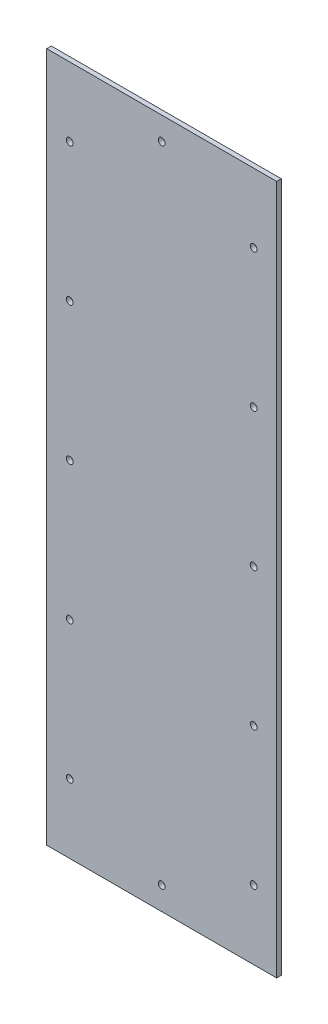
ISO-10303-21;
HEADER;
FILE_DESCRIPTION(('STEP AP214'),'2;1');
FILE_NAME('part.step','',(''),(''),'','','');
FILE_SCHEMA(('AUTOMOTIVE_DESIGN { 1 0 10303 214 1 1 1 1 }'));
ENDSEC;
DATA;
#1=APPLICATION_CONTEXT('core data for automotive mechanical design processes');
#2=APPLICATION_PROTOCOL_DEFINITION('international standard','automotive_design',2000,#1);
#3=PRODUCT_CONTEXT('',#1,'mechanical');
#4=PRODUCT('Part','Part','',(#3));
#5=PRODUCT_RELATED_PRODUCT_CATEGORY('part','',(#4));
#6=PRODUCT_DEFINITION_FORMATION('','',#4);
#7=PRODUCT_DEFINITION_CONTEXT('part definition',#1,'design');
#8=PRODUCT_DEFINITION('design','',#6,#7);
#9=PRODUCT_DEFINITION_SHAPE('','',#8);
#10=(LENGTH_UNIT() NAMED_UNIT(*) SI_UNIT(.MILLI.,.METRE.));
#11=(NAMED_UNIT(*) PLANE_ANGLE_UNIT() SI_UNIT($,.RADIAN.));
#12=(NAMED_UNIT(*) SI_UNIT($,.STERADIAN.) SOLID_ANGLE_UNIT());
#13=UNCERTAINTY_MEASURE_WITH_UNIT(LENGTH_MEASURE(1.E-05),#10,'distance_accuracy_value','');
#14=(GEOMETRIC_REPRESENTATION_CONTEXT(3) GLOBAL_UNCERTAINTY_ASSIGNED_CONTEXT((#13)) GLOBAL_UNIT_ASSIGNED_CONTEXT((#10,
#11,#12)) REPRESENTATION_CONTEXT('',''));
#15=CARTESIAN_POINT('',(0.,0.,0.));
#16=DIRECTION('',(0.,0.,1.));
#17=DIRECTION('',(1.,0.,0.));
#18=AXIS2_PLACEMENT_3D('',#15,#16,#17);
#19=CARTESIAN_POINT('',(0.,0.,2.));
#20=DIRECTION('',(0.,0.,1.));
#21=DIRECTION('',(1.,0.,0.));
#22=AXIS2_PLACEMENT_3D('',#19,#20,#21);
#23=PLANE('',#22);
#24=CARTESIAN_POINT('',(50.,-10.,2.));
#25=DIRECTION('',(0.,0.,1.));
#26=DIRECTION('',(1.,0.,0.));
#27=AXIS2_PLACEMENT_3D('',#24,#25,#26);
#28=CIRCLE('',#27,1.5);
#29=CARTESIAN_POINT('',(51.5,-10.,2.));
#30=VERTEX_POINT('',#29);
#31=EDGE_CURVE('E162',#30,#30,#28,.T.);
#32=ORIENTED_EDGE('',*,*,#31,.F.);
#33=EDGE_LOOP('',(#32));
#34=FACE_BOUND('',#33,.T.);
#35=CARTESIAN_POINT('',(90.,-90.,2.));
#36=DIRECTION('',(0.,0.,-1.));
#37=DIRECTION('',(-1.,0.,0.));
#38=AXIS2_PLACEMENT_3D('',#35,#36,#37);
#39=CIRCLE('',#38,1.50000000000002);
#40=CARTESIAN_POINT('',(88.5,-90.,2.));
#41=VERTEX_POINT('',#40);
#42=EDGE_CURVE('E207',#41,#41,#39,.T.);
#43=ORIENTED_EDGE('',*,*,#42,.T.);
#44=EDGE_LOOP('',(#43));
#45=FACE_BOUND('',#44,.T.);
#46=CARTESIAN_POINT('',(10.,-210.,2.));
#47=DIRECTION('',(0.,0.,-1.));
#48=DIRECTION('',(-1.,0.,0.));
#49=AXIS2_PLACEMENT_3D('',#46,#47,#48);
#50=CIRCLE('',#49,1.5);
#51=CARTESIAN_POINT('',(8.50000000000001,-210.,2.));
#52=VERTEX_POINT('',#51);
#53=EDGE_CURVE('E133',#52,#52,#50,.T.);
#54=ORIENTED_EDGE('',*,*,#53,.T.);
#55=EDGE_LOOP('',(#54));
#56=FACE_BOUND('',#55,.T.);
#57=CARTESIAN_POINT('',(50.,-290.,2.));
#58=DIRECTION('',(0.,0.,-1.));
#59=DIRECTION('',(-1.,0.,0.));
#60=AXIS2_PLACEMENT_3D('',#57,#58,#59);
#61=CIRCLE('',#60,1.5);
#62=CARTESIAN_POINT('',(48.5,-290.,2.));
#63=VERTEX_POINT('',#62);
#64=EDGE_CURVE('E184',#63,#63,#61,.T.);
#65=ORIENTED_EDGE('',*,*,#64,.T.);
#66=EDGE_LOOP('',(#65));
#67=FACE_BOUND('',#66,.T.);
#68=CARTESIAN_POINT('',(90.0000000000001,-270.,2.));
#69=DIRECTION('',(0.,0.,1.));
#70=DIRECTION('',(1.,0.,0.));
#71=AXIS2_PLACEMENT_3D('',#68,#69,#70);
#72=CIRCLE('',#71,1.49999999999998);
#73=CARTESIAN_POINT('',(91.5000000000001,-270.,2.));
#74=VERTEX_POINT('',#73);
#75=EDGE_CURVE('E176',#74,#74,#72,.T.);
#76=ORIENTED_EDGE('',*,*,#75,.F.);
#77=EDGE_LOOP('',(#76));
#78=FACE_BOUND('',#77,.T.);
#79=CARTESIAN_POINT('',(90.,-210.,2.));
#80=DIRECTION('',(0.,0.,1.));
#81=DIRECTION('',(1.,0.,0.));
#82=AXIS2_PLACEMENT_3D('',#79,#80,#81);
#83=CIRCLE('',#82,1.5);
#84=CARTESIAN_POINT('',(91.5,-210.,2.));
#85=VERTEX_POINT('',#84);
#86=EDGE_CURVE('E167',#85,#85,#83,.T.);
#87=ORIENTED_EDGE('',*,*,#86,.F.);
#88=EDGE_LOOP('',(#87));
#89=FACE_BOUND('',#88,.T.);
#90=DIRECTION('',(0.,-1.,0.));
#91=VECTOR('',#90,1.);
#92=CARTESIAN_POINT('',(0.,0.,2.));
#93=LINE('',#92,#91);
#94=CARTESIAN_POINT('',(0.,0.,2.));
#95=VERTEX_POINT('',#94);
#96=CARTESIAN_POINT('',(0.,-300.,2.));
#97=VERTEX_POINT('',#96);
#98=EDGE_CURVE('E91',#95,#97,#93,.T.);
#99=ORIENTED_EDGE('',*,*,#98,.T.);
#100=DIRECTION('',(1.,0.,0.));
#101=VECTOR('',#100,1.);
#102=CARTESIAN_POINT('',(0.,-300.,2.));
#103=LINE('',#102,#101);
#104=CARTESIAN_POINT('',(100.,-300.,2.));
#105=VERTEX_POINT('',#104);
#106=EDGE_CURVE('E86',#97,#105,#103,.T.);
#107=ORIENTED_EDGE('',*,*,#106,.T.);
#108=DIRECTION('',(0.,1.,0.));
#109=VECTOR('',#108,1.);
#110=CARTESIAN_POINT('',(100.,0.,2.));
#111=LINE('',#110,#109);
#112=CARTESIAN_POINT('',(100.,0.,2.));
#113=VERTEX_POINT('',#112);
#114=EDGE_CURVE('E89',#105,#113,#111,.T.);
#115=ORIENTED_EDGE('',*,*,#114,.T.);
#116=DIRECTION('',(-1.,0.,0.));
#117=VECTOR('',#116,1.);
#118=CARTESIAN_POINT('',(0.,0.,2.));
#119=LINE('',#118,#117);
#120=EDGE_CURVE('E56',#113,#95,#119,.T.);
#121=ORIENTED_EDGE('',*,*,#120,.T.);
#122=EDGE_LOOP('',(#99,#107,#115,#121));
#123=FACE_BOUND('',#122,.T.);
#124=CARTESIAN_POINT('',(9.99999999999999,-270.,2.));
#125=DIRECTION('',(0.,0.,-1.));
#126=DIRECTION('',(-1.,0.,0.));
#127=AXIS2_PLACEMENT_3D('',#124,#125,#126);
#128=CIRCLE('',#127,1.5);
#129=CARTESIAN_POINT('',(8.49999999999999,-270.,2.));
#130=VERTEX_POINT('',#129);
#131=EDGE_CURVE('E134',#130,#130,#128,.T.);
#132=ORIENTED_EDGE('',*,*,#131,.T.);
#133=EDGE_LOOP('',(#132));
#134=FACE_BOUND('',#133,.T.);
#135=CARTESIAN_POINT('',(10.,-150.,2.));
#136=DIRECTION('',(0.,0.,1.));
#137=DIRECTION('',(1.,0.,0.));
#138=AXIS2_PLACEMENT_3D('',#135,#136,#137);
#139=CIRCLE('',#138,1.5);
#140=CARTESIAN_POINT('',(11.5,-150.,2.));
#141=VERTEX_POINT('',#140);
#142=EDGE_CURVE('E142',#141,#141,#139,.T.);
#143=ORIENTED_EDGE('',*,*,#142,.F.);
#144=EDGE_LOOP('',(#143));
#145=FACE_BOUND('',#144,.T.);
#146=CARTESIAN_POINT('',(10.,-90.,2.));
#147=DIRECTION('',(0.,0.,1.));
#148=DIRECTION('',(1.,0.,0.));
#149=AXIS2_PLACEMENT_3D('',#146,#147,#148);
#150=CIRCLE('',#149,1.5);
#151=CARTESIAN_POINT('',(11.5,-90.,2.));
#152=VERTEX_POINT('',#151);
#153=EDGE_CURVE('E150',#152,#152,#150,.T.);
#154=ORIENTED_EDGE('',*,*,#153,.F.);
#155=EDGE_LOOP('',(#154));
#156=FACE_BOUND('',#155,.T.);
#157=CARTESIAN_POINT('',(9.99999999999999,-30.,2.));
#158=DIRECTION('',(0.,0.,1.));
#159=DIRECTION('',(1.,0.,0.));
#160=AXIS2_PLACEMENT_3D('',#157,#158,#159);
#161=CIRCLE('',#160,1.5);
#162=CARTESIAN_POINT('',(11.5,-30.,2.));
#163=VERTEX_POINT('',#162);
#164=EDGE_CURVE('E158',#163,#163,#161,.T.);
#165=ORIENTED_EDGE('',*,*,#164,.F.);
#166=EDGE_LOOP('',(#165));
#167=FACE_BOUND('',#166,.T.);
#168=CARTESIAN_POINT('',(90.,-150.,2.));
#169=DIRECTION('',(0.,0.,-1.));
#170=DIRECTION('',(-1.,0.,0.));
#171=AXIS2_PLACEMENT_3D('',#168,#169,#170);
#172=CIRCLE('',#171,1.50000000000001);
#173=CARTESIAN_POINT('',(88.5,-150.,2.));
#174=VERTEX_POINT('',#173);
#175=EDGE_CURVE('E168',#174,#174,#172,.T.);
#176=ORIENTED_EDGE('',*,*,#175,.T.);
#177=EDGE_LOOP('',(#176));
#178=FACE_BOUND('',#177,.T.);
#179=CARTESIAN_POINT('',(90.,-30.,2.));
#180=DIRECTION('',(0.,0.,-1.));
#181=DIRECTION('',(-1.,0.,0.));
#182=AXIS2_PLACEMENT_3D('',#179,#180,#181);
#183=CIRCLE('',#182,1.50000000000001);
#184=CARTESIAN_POINT('',(88.5,-30.,2.));
#185=VERTEX_POINT('',#184);
#186=EDGE_CURVE('E199',#185,#185,#183,.T.);
#187=ORIENTED_EDGE('',*,*,#186,.T.);
#188=EDGE_LOOP('',(#187));
#189=FACE_BOUND('',#188,.T.);
#190=ADVANCED_FACE('F38',(#34,#45,#56,#67,#78,#89,#123,#134,#145,#156,#167,#178,#189),#23,.T.);
#191=CARTESIAN_POINT('',(0.,0.,0.));
#192=DIRECTION('',(0.,0.,1.));
#193=DIRECTION('',(1.,0.,0.));
#194=AXIS2_PLACEMENT_3D('',#191,#192,#193);
#195=PLANE('',#194);
#196=CARTESIAN_POINT('',(50.,-10.,0.));
#197=DIRECTION('',(0.,0.,1.));
#198=DIRECTION('',(1.,0.,0.));
#199=AXIS2_PLACEMENT_3D('',#196,#197,#198);
#200=CIRCLE('',#199,1.5);
#201=CARTESIAN_POINT('',(51.5,-10.,0.));
#202=VERTEX_POINT('',#201);
#203=EDGE_CURVE('E111',#202,#202,#200,.T.);
#204=ORIENTED_EDGE('',*,*,#203,.T.);
#205=EDGE_LOOP('',(#204));
#206=FACE_BOUND('',#205,.T.);
#207=CARTESIAN_POINT('',(9.99999999999999,-30.,0.));
#208=DIRECTION('',(0.,0.,1.));
#209=DIRECTION('',(1.,0.,0.));
#210=AXIS2_PLACEMENT_3D('',#207,#208,#209);
#211=CIRCLE('',#210,1.5);
#212=CARTESIAN_POINT('',(11.5,-30.,0.));
#213=VERTEX_POINT('',#212);
#214=EDGE_CURVE('E154',#213,#213,#211,.T.);
#215=ORIENTED_EDGE('',*,*,#214,.T.);
#216=EDGE_LOOP('',(#215));
#217=FACE_BOUND('',#216,.T.);
#218=CARTESIAN_POINT('',(10.,-90.,0.));
#219=DIRECTION('',(0.,0.,1.));
#220=DIRECTION('',(1.,0.,0.));
#221=AXIS2_PLACEMENT_3D('',#218,#219,#220);
#222=CIRCLE('',#221,1.5);
#223=CARTESIAN_POINT('',(11.5,-90.,0.));
#224=VERTEX_POINT('',#223);
#225=EDGE_CURVE('E146',#224,#224,#222,.T.);
#226=ORIENTED_EDGE('',*,*,#225,.T.);
#227=EDGE_LOOP('',(#226));
#228=FACE_BOUND('',#227,.T.);
#229=CARTESIAN_POINT('',(10.,-150.,0.));
#230=DIRECTION('',(0.,0.,1.));
#231=DIRECTION('',(1.,0.,0.));
#232=AXIS2_PLACEMENT_3D('',#229,#230,#231);
#233=CIRCLE('',#232,1.5);
#234=CARTESIAN_POINT('',(11.5,-150.,0.));
#235=VERTEX_POINT('',#234);
#236=EDGE_CURVE('E138',#235,#235,#233,.T.);
#237=ORIENTED_EDGE('',*,*,#236,.T.);
#238=EDGE_LOOP('',(#237));
#239=FACE_BOUND('',#238,.T.);
#240=CARTESIAN_POINT('',(90.0000000000001,-270.,0.));
#241=DIRECTION('',(0.,0.,1.));
#242=DIRECTION('',(1.,0.,0.));
#243=AXIS2_PLACEMENT_3D('',#240,#241,#242);
#244=CIRCLE('',#243,1.49999999999998);
#245=CARTESIAN_POINT('',(91.5000000000001,-270.,0.));
#246=VERTEX_POINT('',#245);
#247=EDGE_CURVE('E172',#246,#246,#244,.T.);
#248=ORIENTED_EDGE('',*,*,#247,.T.);
#249=EDGE_LOOP('',(#248));
#250=FACE_BOUND('',#249,.T.);
#251=CARTESIAN_POINT('',(90.,-210.,0.));
#252=DIRECTION('',(0.,0.,1.));
#253=DIRECTION('',(1.,0.,0.));
#254=AXIS2_PLACEMENT_3D('',#251,#252,#253);
#255=CIRCLE('',#254,1.5);
#256=CARTESIAN_POINT('',(91.5,-210.,0.));
#257=VERTEX_POINT('',#256);
#258=EDGE_CURVE('E163',#257,#257,#255,.T.);
#259=ORIENTED_EDGE('',*,*,#258,.T.);
#260=EDGE_LOOP('',(#259));
#261=FACE_BOUND('',#260,.T.);
#262=DIRECTION('',(0.,-1.,0.));
#263=VECTOR('',#262,1.);
#264=CARTESIAN_POINT('',(0.,0.,0.));
#265=LINE('',#264,#263);
#266=CARTESIAN_POINT('',(0.,0.,0.));
#267=VERTEX_POINT('',#266);
#268=CARTESIAN_POINT('',(0.,-300.,0.));
#269=VERTEX_POINT('',#268);
#270=EDGE_CURVE('E107',#267,#269,#265,.T.);
#271=ORIENTED_EDGE('',*,*,#270,.F.);
#272=DIRECTION('',(-1.,0.,0.));
#273=VECTOR('',#272,1.);
#274=CARTESIAN_POINT('',(0.,0.,0.));
#275=LINE('',#274,#273);
#276=CARTESIAN_POINT('',(100.,0.,0.));
#277=VERTEX_POINT('',#276);
#278=EDGE_CURVE('E79',#277,#267,#275,.T.);
#279=ORIENTED_EDGE('',*,*,#278,.F.);
#280=DIRECTION('',(0.,1.,0.));
#281=VECTOR('',#280,1.);
#282=CARTESIAN_POINT('',(100.,0.,0.));
#283=LINE('',#282,#281);
#284=CARTESIAN_POINT('',(100.,-300.,0.));
#285=VERTEX_POINT('',#284);
#286=EDGE_CURVE('E73',#285,#277,#283,.T.);
#287=ORIENTED_EDGE('',*,*,#286,.F.);
#288=DIRECTION('',(1.,0.,0.));
#289=VECTOR('',#288,1.);
#290=CARTESIAN_POINT('',(0.,-300.,0.));
#291=LINE('',#290,#289);
#292=EDGE_CURVE('E96',#269,#285,#291,.T.);
#293=ORIENTED_EDGE('',*,*,#292,.F.);
#294=EDGE_LOOP('',(#271,#279,#287,#293));
#295=FACE_BOUND('',#294,.T.);
#296=CARTESIAN_POINT('',(50.,-290.,0.));
#297=DIRECTION('',(0.,0.,-1.));
#298=DIRECTION('',(-1.,0.,0.));
#299=AXIS2_PLACEMENT_3D('',#296,#297,#298);
#300=CIRCLE('',#299,1.5);
#301=CARTESIAN_POINT('',(48.5,-290.,0.));
#302=VERTEX_POINT('',#301);
#303=EDGE_CURVE('E180',#302,#302,#300,.T.);
#304=ORIENTED_EDGE('',*,*,#303,.F.);
#305=EDGE_LOOP('',(#304));
#306=FACE_BOUND('',#305,.T.);
#307=CARTESIAN_POINT('',(9.99999999999999,-270.,0.));
#308=DIRECTION('',(0.,0.,-1.));
#309=DIRECTION('',(-1.,0.,0.));
#310=AXIS2_PLACEMENT_3D('',#307,#308,#309);
#311=CIRCLE('',#310,1.5);
#312=CARTESIAN_POINT('',(8.49999999999999,-270.,0.));
#313=VERTEX_POINT('',#312);
#314=EDGE_CURVE('E188',#313,#313,#311,.T.);
#315=ORIENTED_EDGE('',*,*,#314,.F.);
#316=EDGE_LOOP('',(#315));
#317=FACE_BOUND('',#316,.T.);
#318=CARTESIAN_POINT('',(10.,-210.,0.));
#319=DIRECTION('',(0.,0.,-1.));
#320=DIRECTION('',(-1.,0.,0.));
#321=AXIS2_PLACEMENT_3D('',#318,#319,#320);
#322=CIRCLE('',#321,1.5);
#323=CARTESIAN_POINT('',(8.50000000000001,-210.,0.));
#324=VERTEX_POINT('',#323);
#325=EDGE_CURVE('E129',#324,#324,#322,.T.);
#326=ORIENTED_EDGE('',*,*,#325,.F.);
#327=EDGE_LOOP('',(#326));
#328=FACE_BOUND('',#327,.T.);
#329=CARTESIAN_POINT('',(90.,-150.,0.));
#330=DIRECTION('',(0.,0.,-1.));
#331=DIRECTION('',(-1.,0.,0.));
#332=AXIS2_PLACEMENT_3D('',#329,#330,#331);
#333=CIRCLE('',#332,1.50000000000001);
#334=CARTESIAN_POINT('',(88.5,-150.,0.));
#335=VERTEX_POINT('',#334);
#336=EDGE_CURVE('E211',#335,#335,#333,.T.);
#337=ORIENTED_EDGE('',*,*,#336,.F.);
#338=EDGE_LOOP('',(#337));
#339=FACE_BOUND('',#338,.T.);
#340=CARTESIAN_POINT('',(90.,-90.,0.));
#341=DIRECTION('',(0.,0.,-1.));
#342=DIRECTION('',(-1.,0.,0.));
#343=AXIS2_PLACEMENT_3D('',#340,#341,#342);
#344=CIRCLE('',#343,1.50000000000002);
#345=CARTESIAN_POINT('',(88.5,-90.,0.));
#346=VERTEX_POINT('',#345);
#347=EDGE_CURVE('E203',#346,#346,#344,.T.);
#348=ORIENTED_EDGE('',*,*,#347,.F.);
#349=EDGE_LOOP('',(#348));
#350=FACE_BOUND('',#349,.T.);
#351=CARTESIAN_POINT('',(90.,-30.,0.));
#352=DIRECTION('',(0.,0.,-1.));
#353=DIRECTION('',(-1.,0.,0.));
#354=AXIS2_PLACEMENT_3D('',#351,#352,#353);
#355=CIRCLE('',#354,1.50000000000001);
#356=CARTESIAN_POINT('',(88.5,-30.,0.));
#357=VERTEX_POINT('',#356);
#358=EDGE_CURVE('E195',#357,#357,#355,.T.);
#359=ORIENTED_EDGE('',*,*,#358,.F.);
#360=EDGE_LOOP('',(#359));
#361=FACE_BOUND('',#360,.T.);
#362=ADVANCED_FACE('F124',(#206,#217,#228,#239,#250,#261,#295,#306,#317,#328,#339,#350,#361),
#195,.F.);
#363=CARTESIAN_POINT('',(0.,0.,2.));
#364=DIRECTION('',(1.,0.,0.));
#365=DIRECTION('',(0.,1.,0.));
#366=AXIS2_PLACEMENT_3D('',#363,#364,#365);
#367=PLANE('',#366);
#368=ORIENTED_EDGE('',*,*,#270,.T.);
#369=DIRECTION('',(0.,0.,-1.));
#370=VECTOR('',#369,1.);
#371=CARTESIAN_POINT('',(0.,-300.,2.));
#372=LINE('',#371,#370);
#373=EDGE_CURVE('E11',#97,#269,#372,.T.);
#374=ORIENTED_EDGE('',*,*,#373,.F.);
#375=ORIENTED_EDGE('',*,*,#98,.F.);
#376=DIRECTION('',(0.,0.,-1.));
#377=VECTOR('',#376,1.);
#378=CARTESIAN_POINT('',(0.,0.,2.));
#379=LINE('',#378,#377);
#380=EDGE_CURVE('E103',#95,#267,#379,.T.);
#381=ORIENTED_EDGE('',*,*,#380,.T.);
#382=EDGE_LOOP('',(#368,#374,#375,#381));
#383=FACE_BOUND('',#382,.T.);
#384=ADVANCED_FACE('F40',(#383),#367,.F.);
#385=CARTESIAN_POINT('',(0.,-300.,2.));
#386=DIRECTION('',(0.,1.,0.));
#387=DIRECTION('',(0.,0.,1.));
#388=AXIS2_PLACEMENT_3D('',#385,#386,#387);
#389=PLANE('',#388);
#390=ORIENTED_EDGE('',*,*,#292,.T.);
#391=DIRECTION('',(0.,0.,-1.));
#392=VECTOR('',#391,1.);
#393=CARTESIAN_POINT('',(100.,-300.,2.));
#394=LINE('',#393,#392);
#395=EDGE_CURVE('E48',#105,#285,#394,.T.);
#396=ORIENTED_EDGE('',*,*,#395,.F.);
#397=ORIENTED_EDGE('',*,*,#106,.F.);
#398=ORIENTED_EDGE('',*,*,#373,.T.);
#399=EDGE_LOOP('',(#390,#396,#397,#398));
#400=FACE_BOUND('',#399,.T.);
#401=ADVANCED_FACE('F95',(#400),#389,.F.);
#402=CARTESIAN_POINT('',(100.,0.,2.));
#403=DIRECTION('',(-1.,0.,0.));
#404=DIRECTION('',(0.,-1.,0.));
#405=AXIS2_PLACEMENT_3D('',#402,#403,#404);
#406=PLANE('',#405);
#407=ORIENTED_EDGE('',*,*,#286,.T.);
#408=DIRECTION('',(0.,0.,-1.));
#409=VECTOR('',#408,1.);
#410=CARTESIAN_POINT('',(100.,0.,2.));
#411=LINE('',#410,#409);
#412=EDGE_CURVE('E98',#113,#277,#411,.T.);
#413=ORIENTED_EDGE('',*,*,#412,.F.);
#414=ORIENTED_EDGE('',*,*,#114,.F.);
#415=ORIENTED_EDGE('',*,*,#395,.T.);
#416=EDGE_LOOP('',(#407,#413,#414,#415));
#417=FACE_BOUND('',#416,.T.);
#418=ADVANCED_FACE('F99',(#417),#406,.F.);
#419=CARTESIAN_POINT('',(0.,0.,2.));
#420=DIRECTION('',(0.,-1.,0.));
#421=DIRECTION('',(0.,0.,-1.));
#422=AXIS2_PLACEMENT_3D('',#419,#420,#421);
#423=PLANE('',#422);
#424=ORIENTED_EDGE('',*,*,#278,.T.);
#425=ORIENTED_EDGE('',*,*,#380,.F.);
#426=ORIENTED_EDGE('',*,*,#120,.F.);
#427=ORIENTED_EDGE('',*,*,#412,.T.);
#428=EDGE_LOOP('',(#424,#425,#426,#427));
#429=FACE_BOUND('',#428,.T.);
#430=ADVANCED_FACE('F121',(#429),#423,.F.);
#431=CARTESIAN_POINT('',(90.,-210.,0.));
#432=DIRECTION('',(0.,0.,1.));
#433=DIRECTION('',(1.,0.,0.));
#434=AXIS2_PLACEMENT_3D('',#431,#432,#433);
#435=CYLINDRICAL_SURFACE('',#434,1.5);
#436=ORIENTED_EDGE('',*,*,#258,.F.);
#437=EDGE_LOOP('',(#436));
#438=FACE_BOUND('',#437,.T.);
#439=ORIENTED_EDGE('',*,*,#86,.T.);
#440=EDGE_LOOP('',(#439));
#441=FACE_BOUND('',#440,.T.);
#442=ADVANCED_FACE('F247',(#438,#441),#435,.F.);
#443=CARTESIAN_POINT('',(90.0000000000001,-270.,0.));
#444=DIRECTION('',(0.,0.,1.));
#445=DIRECTION('',(1.,0.,0.));
#446=AXIS2_PLACEMENT_3D('',#443,#444,#445);
#447=CYLINDRICAL_SURFACE('',#446,1.49999999999998);
#448=ORIENTED_EDGE('',*,*,#247,.F.);
#449=EDGE_LOOP('',(#448));
#450=FACE_BOUND('',#449,.T.);
#451=ORIENTED_EDGE('',*,*,#75,.T.);
#452=EDGE_LOOP('',(#451));
#453=FACE_BOUND('',#452,.T.);
#454=ADVANCED_FACE('F249',(#450,#453),#447,.F.);
#455=CARTESIAN_POINT('',(50.,-290.,0.));
#456=DIRECTION('',(0.,0.,1.));
#457=DIRECTION('',(1.,0.,0.));
#458=AXIS2_PLACEMENT_3D('',#455,#456,#457);
#459=CYLINDRICAL_SURFACE('',#458,1.5);
#460=ORIENTED_EDGE('',*,*,#303,.T.);
#461=EDGE_LOOP('',(#460));
#462=FACE_BOUND('',#461,.T.);
#463=ORIENTED_EDGE('',*,*,#64,.F.);
#464=EDGE_LOOP('',(#463));
#465=FACE_BOUND('',#464,.T.);
#466=ADVANCED_FACE('F256',(#462,#465),#459,.F.);
#467=CARTESIAN_POINT('',(9.99999999999999,-270.,0.));
#468=DIRECTION('',(0.,0.,1.));
#469=DIRECTION('',(1.,0.,0.));
#470=AXIS2_PLACEMENT_3D('',#467,#468,#469);
#471=CYLINDRICAL_SURFACE('',#470,1.5);
#472=ORIENTED_EDGE('',*,*,#314,.T.);
#473=EDGE_LOOP('',(#472));
#474=FACE_BOUND('',#473,.T.);
#475=ORIENTED_EDGE('',*,*,#131,.F.);
#476=EDGE_LOOP('',(#475));
#477=FACE_BOUND('',#476,.T.);
#478=ADVANCED_FACE('F278',(#474,#477),#471,.F.);
#479=CARTESIAN_POINT('',(10.,-210.,0.));
#480=DIRECTION('',(0.,0.,1.));
#481=DIRECTION('',(1.,0.,0.));
#482=AXIS2_PLACEMENT_3D('',#479,#480,#481);
#483=CYLINDRICAL_SURFACE('',#482,1.5);
#484=ORIENTED_EDGE('',*,*,#325,.T.);
#485=EDGE_LOOP('',(#484));
#486=FACE_BOUND('',#485,.T.);
#487=ORIENTED_EDGE('',*,*,#53,.F.);
#488=EDGE_LOOP('',(#487));
#489=FACE_BOUND('',#488,.T.);
#490=ADVANCED_FACE('F275',(#486,#489),#483,.F.);
#491=CARTESIAN_POINT('',(10.,-150.,0.));
#492=DIRECTION('',(0.,0.,1.));
#493=DIRECTION('',(1.,0.,0.));
#494=AXIS2_PLACEMENT_3D('',#491,#492,#493);
#495=CYLINDRICAL_SURFACE('',#494,1.5);
#496=ORIENTED_EDGE('',*,*,#236,.F.);
#497=EDGE_LOOP('',(#496));
#498=FACE_BOUND('',#497,.T.);
#499=ORIENTED_EDGE('',*,*,#142,.T.);
#500=EDGE_LOOP('',(#499));
#501=FACE_BOUND('',#500,.T.);
#502=ADVANCED_FACE('F271',(#498,#501),#495,.F.);
#503=CARTESIAN_POINT('',(10.,-90.,0.));
#504=DIRECTION('',(0.,0.,1.));
#505=DIRECTION('',(1.,0.,0.));
#506=AXIS2_PLACEMENT_3D('',#503,#504,#505);
#507=CYLINDRICAL_SURFACE('',#506,1.5);
#508=ORIENTED_EDGE('',*,*,#225,.F.);
#509=EDGE_LOOP('',(#508));
#510=FACE_BOUND('',#509,.T.);
#511=ORIENTED_EDGE('',*,*,#153,.T.);
#512=EDGE_LOOP('',(#511));
#513=FACE_BOUND('',#512,.T.);
#514=ADVANCED_FACE('F267',(#510,#513),#507,.F.);
#515=CARTESIAN_POINT('',(9.99999999999999,-30.,0.));
#516=DIRECTION('',(0.,0.,1.));
#517=DIRECTION('',(1.,0.,0.));
#518=AXIS2_PLACEMENT_3D('',#515,#516,#517);
#519=CYLINDRICAL_SURFACE('',#518,1.5);
#520=ORIENTED_EDGE('',*,*,#214,.F.);
#521=EDGE_LOOP('',(#520));
#522=FACE_BOUND('',#521,.T.);
#523=ORIENTED_EDGE('',*,*,#164,.T.);
#524=EDGE_LOOP('',(#523));
#525=FACE_BOUND('',#524,.T.);
#526=ADVANCED_FACE('F263',(#522,#525),#519,.F.);
#527=CARTESIAN_POINT('',(90.,-150.,0.));
#528=DIRECTION('',(0.,0.,1.));
#529=DIRECTION('',(1.,0.,0.));
#530=AXIS2_PLACEMENT_3D('',#527,#528,#529);
#531=CYLINDRICAL_SURFACE('',#530,1.50000000000001);
#532=ORIENTED_EDGE('',*,*,#336,.T.);
#533=EDGE_LOOP('',(#532));
#534=FACE_BOUND('',#533,.T.);
#535=ORIENTED_EDGE('',*,*,#175,.F.);
#536=EDGE_LOOP('',(#535));
#537=FACE_BOUND('',#536,.T.);
#538=ADVANCED_FACE('F266',(#534,#537),#531,.F.);
#539=CARTESIAN_POINT('',(90.,-90.,0.));
#540=DIRECTION('',(0.,0.,1.));
#541=DIRECTION('',(1.,0.,0.));
#542=AXIS2_PLACEMENT_3D('',#539,#540,#541);
#543=CYLINDRICAL_SURFACE('',#542,1.50000000000002);
#544=ORIENTED_EDGE('',*,*,#347,.T.);
#545=EDGE_LOOP('',(#544));
#546=FACE_BOUND('',#545,.T.);
#547=ORIENTED_EDGE('',*,*,#42,.F.);
#548=EDGE_LOOP('',(#547));
#549=FACE_BOUND('',#548,.T.);
#550=ADVANCED_FACE('F372',(#546,#549),#543,.F.);
#551=CARTESIAN_POINT('',(90.,-30.,0.));
#552=DIRECTION('',(0.,0.,1.));
#553=DIRECTION('',(1.,0.,0.));
#554=AXIS2_PLACEMENT_3D('',#551,#552,#553);
#555=CYLINDRICAL_SURFACE('',#554,1.50000000000001);
#556=ORIENTED_EDGE('',*,*,#358,.T.);
#557=EDGE_LOOP('',(#556));
#558=FACE_BOUND('',#557,.T.);
#559=ORIENTED_EDGE('',*,*,#186,.F.);
#560=EDGE_LOOP('',(#559));
#561=FACE_BOUND('',#560,.T.);
#562=ADVANCED_FACE('F230',(#558,#561),#555,.F.);
#563=CARTESIAN_POINT('',(50.,-10.,0.));
#564=DIRECTION('',(0.,0.,1.));
#565=DIRECTION('',(1.,0.,0.));
#566=AXIS2_PLACEMENT_3D('',#563,#564,#565);
#567=CYLINDRICAL_SURFACE('',#566,1.5);
#568=ORIENTED_EDGE('',*,*,#203,.F.);
#569=EDGE_LOOP('',(#568));
#570=FACE_BOUND('',#569,.T.);
#571=ORIENTED_EDGE('',*,*,#31,.T.);
#572=EDGE_LOOP('',(#571));
#573=FACE_BOUND('',#572,.T.);
#574=ADVANCED_FACE('F227',(#570,#573),#567,.F.);
#575=CLOSED_SHELL('',(#190,#362,#384,#401,#418,#430,#442,#454,#466,#478,#490,#502,#514,#526,
#538,#550,#562,#574));
#576=MANIFOLD_SOLID_BREP('B2',#575);
#577=ADVANCED_BREP_SHAPE_REPRESENTATION('',(#18,#576),#14);
#578=SHAPE_DEFINITION_REPRESENTATION(#9,#577);
ENDSEC;
END-ISO-10303-21;
